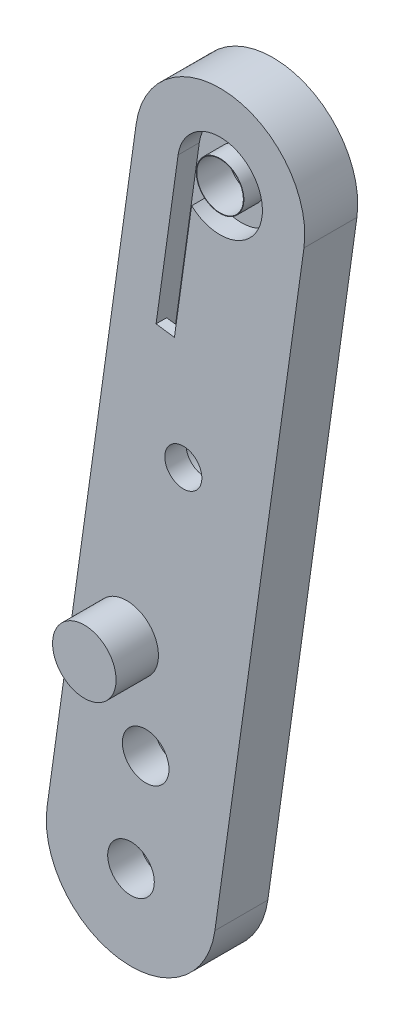
ISO-10303-21;
HEADER;
FILE_DESCRIPTION(('STEP AP214'),'2;1');
FILE_NAME('part.step','',(''),(''),'','','');
FILE_SCHEMA(('AUTOMOTIVE_DESIGN { 1 0 10303 214 1 1 1 1 }'));
ENDSEC;
DATA;
#1=APPLICATION_CONTEXT('core data for automotive mechanical design processes');
#2=APPLICATION_PROTOCOL_DEFINITION('international standard','automotive_design',2000,#1);
#3=PRODUCT_CONTEXT('',#1,'mechanical');
#4=PRODUCT('Part','Part','',(#3));
#5=PRODUCT_RELATED_PRODUCT_CATEGORY('part','',(#4));
#6=PRODUCT_DEFINITION_FORMATION('','',#4);
#7=PRODUCT_DEFINITION_CONTEXT('part definition',#1,'design');
#8=PRODUCT_DEFINITION('design','',#6,#7);
#9=PRODUCT_DEFINITION_SHAPE('','',#8);
#10=(LENGTH_UNIT() NAMED_UNIT(*) SI_UNIT(.MILLI.,.METRE.));
#11=(NAMED_UNIT(*) PLANE_ANGLE_UNIT() SI_UNIT($,.RADIAN.));
#12=(NAMED_UNIT(*) SI_UNIT($,.STERADIAN.) SOLID_ANGLE_UNIT());
#13=UNCERTAINTY_MEASURE_WITH_UNIT(LENGTH_MEASURE(1.E-05),#10,'distance_accuracy_value','');
#14=(GEOMETRIC_REPRESENTATION_CONTEXT(3) GLOBAL_UNCERTAINTY_ASSIGNED_CONTEXT((#13)) GLOBAL_UNIT_ASSIGNED_CONTEXT((#10,
#11,#12)) REPRESENTATION_CONTEXT('',''));
#15=CARTESIAN_POINT('',(0.,0.,0.));
#16=DIRECTION('',(0.,0.,1.));
#17=DIRECTION('',(1.,0.,0.));
#18=AXIS2_PLACEMENT_3D('',#15,#16,#17);
#19=CARTESIAN_POINT('',(4.12057593436907,29.2917175333188,-3.));
#20=DIRECTION('',(0.,0.,1.));
#21=DIRECTION('',(1.,0.,0.));
#22=AXIS2_PLACEMENT_3D('',#19,#20,#21);
#23=CYLINDRICAL_SURFACE('',#22,2.2);
#24=CARTESIAN_POINT('',(4.12057593436907,29.2917175333188,0.));
#25=DIRECTION('',(0.,0.,1.));
#26=DIRECTION('',(1.,0.,0.));
#27=AXIS2_PLACEMENT_3D('',#24,#25,#26);
#28=CIRCLE('',#27,2.2);
#29=CARTESIAN_POINT('',(6.32057593436907,29.2917175333188,0.));
#30=VERTEX_POINT('',#29);
#31=EDGE_CURVE('E19',#30,#30,#28,.T.);
#32=ORIENTED_EDGE('',*,*,#31,.T.);
#33=EDGE_LOOP('',(#32));
#34=FACE_BOUND('',#33,.T.);
#35=CARTESIAN_POINT('',(4.12057593436907,29.2917175333188,-3.));
#36=DIRECTION('',(0.,0.,1.));
#37=DIRECTION('',(1.,0.,0.));
#38=AXIS2_PLACEMENT_3D('',#35,#36,#37);
#39=CIRCLE('',#38,2.2);
#40=CARTESIAN_POINT('',(6.32057593436907,29.2917175333188,-3.));
#41=VERTEX_POINT('',#40);
#42=EDGE_CURVE('E166',#41,#41,#39,.T.);
#43=ORIENTED_EDGE('',*,*,#42,.F.);
#44=EDGE_LOOP('',(#43));
#45=FACE_BOUND('',#44,.T.);
#46=ADVANCED_FACE('F16',(#34,#45),#23,.F.);
#47=CARTESIAN_POINT('',(0.,0.,0.));
#48=DIRECTION('',(0.,0.,-1.));
#49=DIRECTION('',(-1.,0.,0.));
#50=AXIS2_PLACEMENT_3D('',#47,#48,#49);
#51=PLANE('',#50);
#52=CARTESIAN_POINT('',(4.12057593436907,29.2917175333188,0.));
#53=DIRECTION('',(0.,0.,1.));
#54=DIRECTION('',(1.,0.,0.));
#55=AXIS2_PLACEMENT_3D('',#52,#53,#54);
#56=CIRCLE('',#55,2.25);
#57=CARTESIAN_POINT('',(6.37057593436907,29.2917175333188,0.));
#58=VERTEX_POINT('',#57);
#59=EDGE_CURVE('E171',#58,#58,#56,.F.);
#60=ORIENTED_EDGE('',*,*,#59,.F.);
#61=EDGE_LOOP('',(#60));
#62=FACE_BOUND('',#61,.T.);
#63=ORIENTED_EDGE('',*,*,#31,.F.);
#64=EDGE_LOOP('',(#63));
#65=FACE_BOUND('',#64,.T.);
#66=ADVANCED_FACE('F242',(#62,#65),#51,.F.);
#67=CARTESIAN_POINT('',(0.,0.,-3.));
#68=DIRECTION('',(0.,0.,-1.));
#69=DIRECTION('',(-1.,0.,0.));
#70=AXIS2_PLACEMENT_3D('',#67,#68,#69);
#71=PLANE('',#70);
#72=ORIENTED_EDGE('',*,*,#42,.T.);
#73=EDGE_LOOP('',(#72));
#74=FACE_BOUND('',#73,.T.);
#75=CARTESIAN_POINT('',(4.12057593436907,29.2917175333188,-3.));
#76=DIRECTION('',(0.,0.,1.));
#77=DIRECTION('',(1.,0.,0.));
#78=AXIS2_PLACEMENT_3D('',#75,#76,#77);
#79=CIRCLE('',#78,4.5);
#80=CARTESIAN_POINT('',(8.62057593436907,29.2917175333188,-3.));
#81=VERTEX_POINT('',#80);
#82=EDGE_CURVE('E176',#81,#81,#79,.F.);
#83=ORIENTED_EDGE('',*,*,#82,.T.);
#84=EDGE_LOOP('',(#83));
#85=FACE_BOUND('',#84,.T.);
#86=ADVANCED_FACE('F244',(#74,#85),#71,.T.);
#87=CARTESIAN_POINT('',(1.32896460320901,9.48749557258048,-2.));
#88=DIRECTION('',(-0.138721066002156,-0.990331492908928,0.));
#89=DIRECTION('',(0.990331492908928,-0.138721066002156,0.));
#90=AXIS2_PLACEMENT_3D('',#87,#88,#89);
#91=PLANE('',#90);
#92=DIRECTION('',(0.990331492908928,-0.138721066002157,0.));
#93=VECTOR('',#92,1.);
#94=CARTESIAN_POINT('',(-2.6151713573098,10.0399719391489,-2.));
#95=LINE('',#94,#93);
#96=CARTESIAN_POINT('',(-2.6151713573098,10.0399719391489,-2.));
#97=VERTEX_POINT('',#96);
#98=CARTESIAN_POINT('',(-0.882091244719177,9.79721007364514,-2.));
#99=VERTEX_POINT('',#98);
#100=EDGE_CURVE('E139',#97,#99,#95,.T.);
#101=ORIENTED_EDGE('',*,*,#100,.F.);
#102=DIRECTION('',(0.,0.,1.));
#103=VECTOR('',#102,1.);
#104=CARTESIAN_POINT('',(-2.6151713573098,10.0399719391489,-2.));
#105=LINE('',#104,#103);
#106=CARTESIAN_POINT('',(-2.6151713573098,10.0399719391489,-1.));
#107=VERTEX_POINT('',#106);
#108=EDGE_CURVE('E162',#107,#97,#105,.F.);
#109=ORIENTED_EDGE('',*,*,#108,.F.);
#110=DIRECTION('',(-0.990331492908928,0.138721066002157,0.));
#111=VECTOR('',#110,1.);
#112=CARTESIAN_POINT('',(-0.882091244719177,9.79721007364514,-1.));
#113=LINE('',#112,#111);
#114=CARTESIAN_POINT('',(-0.882091244719177,9.79721007364514,-0.999999999999999));
#115=VERTEX_POINT('',#114);
#116=EDGE_CURVE('E143',#115,#107,#113,.T.);
#117=ORIENTED_EDGE('',*,*,#116,.F.);
#118=DIRECTION('',(0.,0.,1.));
#119=VECTOR('',#118,1.);
#120=CARTESIAN_POINT('',(-0.882091244719177,9.79721007364514,-2.));
#121=LINE('',#120,#119);
#122=EDGE_CURVE('E165',#99,#115,#121,.T.);
#123=ORIENTED_EDGE('',*,*,#122,.F.);
#124=EDGE_LOOP('',(#101,#109,#117,#123));
#125=FACE_BOUND('',#124,.T.);
#126=ADVANCED_FACE('F251',(#125),#91,.F.);
#127=CARTESIAN_POINT('',(4.12057593436907,29.2917175333188,-2.));
#128=DIRECTION('',(0.,0.,1.));
#129=DIRECTION('',(1.,0.,0.));
#130=AXIS2_PLACEMENT_3D('',#127,#128,#129);
#131=CYLINDRICAL_SURFACE('',#130,2.25);
#132=ORIENTED_EDGE('',*,*,#59,.T.);
#133=EDGE_LOOP('',(#132));
#134=FACE_BOUND('',#133,.T.);
#135=CARTESIAN_POINT('',(4.12057593436907,29.2917175333188,-2.));
#136=DIRECTION('',(0.,0.,1.));
#137=DIRECTION('',(1.,0.,0.));
#138=AXIS2_PLACEMENT_3D('',#135,#136,#137);
#139=CIRCLE('',#138,2.25);
#140=CARTESIAN_POINT('',(6.37057593436907,29.2917175333188,-2.));
#141=VERTEX_POINT('',#140);
#142=EDGE_CURVE('E142',#141,#141,#139,.F.);
#143=ORIENTED_EDGE('',*,*,#142,.F.);
#144=EDGE_LOOP('',(#143));
#145=FACE_BOUND('',#144,.T.);
#146=ADVANCED_FACE('F348',(#134,#145),#131,.T.);
#147=CARTESIAN_POINT('',(0.652549284314609,4.53343021059572,-2.));
#148=DIRECTION('',(0.,0.,-1.));
#149=DIRECTION('',(-1.,0.,0.));
#150=AXIS2_PLACEMENT_3D('',#147,#148,#149);
#151=CYLINDRICAL_SURFACE('',#150,3.);
#152=CARTESIAN_POINT('',(0.652549284314609,4.53343021059572,-2.));
#153=DIRECTION('',(0.,0.,-1.));
#154=DIRECTION('',(-1.,0.,0.));
#155=AXIS2_PLACEMENT_3D('',#152,#153,#154);
#156=CIRCLE('',#155,3.);
#157=CARTESIAN_POINT('',(-2.34745071568539,4.53343021059572,-2.));
#158=VERTEX_POINT('',#157);
#159=EDGE_CURVE('E226',#158,#158,#156,.T.);
#160=ORIENTED_EDGE('',*,*,#159,.F.);
#161=EDGE_LOOP('',(#160));
#162=FACE_BOUND('',#161,.T.);
#163=CARTESIAN_POINT('',(0.652549284314609,4.53343021059572,-5.));
#164=DIRECTION('',(0.,0.,-1.));
#165=DIRECTION('',(-1.,0.,0.));
#166=AXIS2_PLACEMENT_3D('',#163,#164,#165);
#167=CIRCLE('',#166,3.);
#168=CARTESIAN_POINT('',(-2.34745071568539,4.53343021059572,-5.));
#169=VERTEX_POINT('',#168);
#170=EDGE_CURVE('E223',#169,#169,#167,.F.);
#171=ORIENTED_EDGE('',*,*,#170,.F.);
#172=EDGE_LOOP('',(#171));
#173=FACE_BOUND('',#172,.T.);
#174=ADVANCED_FACE('F344',(#162,#173),#151,.F.);
#175=CARTESIAN_POINT('',(4.12057593436907,29.2917175333188,-5.));
#176=DIRECTION('',(0.,0.,1.));
#177=DIRECTION('',(1.,0.,0.));
#178=AXIS2_PLACEMENT_3D('',#175,#176,#177);
#179=CYLINDRICAL_SURFACE('',#178,4.5);
#180=ORIENTED_EDGE('',*,*,#82,.F.);
#181=EDGE_LOOP('',(#180));
#182=FACE_BOUND('',#181,.T.);
#183=CARTESIAN_POINT('',(4.12057593436907,29.2917175333188,-5.));
#184=DIRECTION('',(0.,0.,1.));
#185=DIRECTION('',(1.,0.,0.));
#186=AXIS2_PLACEMENT_3D('',#183,#184,#185);
#187=CIRCLE('',#186,4.5);
#188=CARTESIAN_POINT('',(8.62057593436907,29.2917175333188,-5.));
#189=VERTEX_POINT('',#188);
#190=EDGE_CURVE('E214',#189,#189,#187,.T.);
#191=ORIENTED_EDGE('',*,*,#190,.F.);
#192=EDGE_LOOP('',(#191));
#193=FACE_BOUND('',#192,.T.);
#194=ADVANCED_FACE('F340',(#182,#193),#179,.F.);
#195=CARTESIAN_POINT('',(-4.28894176048136,-30.743938574281,-5.));
#196=DIRECTION('',(0.,0.,1.));
#197=DIRECTION('',(1.,0.,0.));
#198=AXIS2_PLACEMENT_3D('',#195,#196,#197);
#199=CYLINDRICAL_SURFACE('',#198,4.5);
#200=CARTESIAN_POINT('',(-4.28894176048136,-30.743938574281,-3.));
#201=DIRECTION('',(0.,0.,1.));
#202=DIRECTION('',(1.,0.,0.));
#203=AXIS2_PLACEMENT_3D('',#200,#201,#202);
#204=CIRCLE('',#203,4.5);
#205=CARTESIAN_POINT('',(0.211058239518639,-30.743938574281,-3.));
#206=VERTEX_POINT('',#205);
#207=EDGE_CURVE('E211',#206,#206,#204,.F.);
#208=ORIENTED_EDGE('',*,*,#207,.F.);
#209=EDGE_LOOP('',(#208));
#210=FACE_BOUND('',#209,.T.);
#211=CARTESIAN_POINT('',(-4.28894176048136,-30.743938574281,-5.));
#212=DIRECTION('',(0.,0.,1.));
#213=DIRECTION('',(1.,0.,0.));
#214=AXIS2_PLACEMENT_3D('',#211,#212,#213);
#215=CIRCLE('',#214,4.5);
#216=CARTESIAN_POINT('',(0.211058239518639,-30.743938574281,-5.));
#217=VERTEX_POINT('',#216);
#218=EDGE_CURVE('E217',#217,#217,#215,.T.);
#219=ORIENTED_EDGE('',*,*,#218,.F.);
#220=EDGE_LOOP('',(#219));
#221=FACE_BOUND('',#220,.T.);
#222=ADVANCED_FACE('F336',(#210,#221),#199,.F.);
#223=CARTESIAN_POINT('',(-2.90173110045983,-20.8406236451918,-5.));
#224=DIRECTION('',(0.,0.,1.));
#225=DIRECTION('',(1.,0.,0.));
#226=AXIS2_PLACEMENT_3D('',#223,#224,#225);
#227=CYLINDRICAL_SURFACE('',#226,4.5);
#228=CARTESIAN_POINT('',(-2.90173110045983,-20.8406236451918,-3.));
#229=DIRECTION('',(0.,0.,1.));
#230=DIRECTION('',(1.,0.,0.));
#231=AXIS2_PLACEMENT_3D('',#228,#229,#230);
#232=CIRCLE('',#231,4.5);
#233=CARTESIAN_POINT('',(1.59826889954017,-20.8406236451918,-3.));
#234=VERTEX_POINT('',#233);
#235=EDGE_CURVE('E208',#234,#234,#232,.F.);
#236=ORIENTED_EDGE('',*,*,#235,.F.);
#237=EDGE_LOOP('',(#236));
#238=FACE_BOUND('',#237,.T.);
#239=CARTESIAN_POINT('',(-2.90173110045983,-20.8406236451918,-5.));
#240=DIRECTION('',(0.,0.,1.));
#241=DIRECTION('',(1.,0.,0.));
#242=AXIS2_PLACEMENT_3D('',#239,#240,#241);
#243=CIRCLE('',#242,4.5);
#244=CARTESIAN_POINT('',(1.59826889954017,-20.8406236451918,-5.));
#245=VERTEX_POINT('',#244);
#246=EDGE_CURVE('E220',#245,#245,#243,.T.);
#247=ORIENTED_EDGE('',*,*,#246,.F.);
#248=EDGE_LOOP('',(#247));
#249=FACE_BOUND('',#248,.T.);
#250=ADVANCED_FACE('F332',(#238,#249),#227,.F.);
#251=CARTESIAN_POINT('',(0.,0.,4.));
#252=DIRECTION('',(0.,0.,1.));
#253=DIRECTION('',(1.,0.,0.));
#254=AXIS2_PLACEMENT_3D('',#251,#252,#253);
#255=PLANE('',#254);
#256=CARTESIAN_POINT('',(-4.69563830162392,-12.0212190760833,4.));
#257=DIRECTION('',(0.,0.,-1.));
#258=DIRECTION('',(-1.,0.,0.));
#259=AXIS2_PLACEMENT_3D('',#256,#257,#258);
#260=CIRCLE('',#259,3.00000000000001);
#261=CARTESIAN_POINT('',(-7.69563830162393,-12.0212190760833,4.));
#262=VERTEX_POINT('',#261);
#263=EDGE_CURVE('E148',#262,#262,#260,.T.);
#264=ORIENTED_EDGE('',*,*,#263,.F.);
#265=EDGE_LOOP('',(#264));
#266=FACE_BOUND('',#265,.T.);
#267=ADVANCED_FACE('F328',(#266),#255,.T.);
#268=CARTESIAN_POINT('',(0.,0.,-1.));
#269=DIRECTION('',(0.,0.,-1.));
#270=DIRECTION('',(-1.,0.,0.));
#271=AXIS2_PLACEMENT_3D('',#268,#269,#270);
#272=PLANE('',#271);
#273=DIRECTION('',(0.138721066002158,0.990331492908928,0.));
#274=VECTOR('',#273,1.);
#275=CARTESIAN_POINT('',(-3.94413596051883,0.552476366568434,-1.));
#276=LINE('',#275,#274);
#277=CARTESIAN_POINT('',(-1.92156602729901,14.9916294036936,-1.));
#278=VERTEX_POINT('',#277);
#279=EDGE_CURVE('E112',#278,#107,#276,.F.);
#280=ORIENTED_EDGE('',*,*,#279,.F.);
#281=DIRECTION('',(-0.990331492908927,0.138721066002158,0.));
#282=VECTOR('',#281,1.);
#283=CARTESIAN_POINT('',(-0.188485914708387,14.7488675381898,-1.));
#284=LINE('',#283,#282);
#285=CARTESIAN_POINT('',(-0.188485914708386,14.7488675381898,-1.));
#286=VERTEX_POINT('',#285);
#287=EDGE_CURVE('E131',#286,#278,#284,.T.);
#288=ORIENTED_EDGE('',*,*,#287,.F.);
#289=DIRECTION('',(0.138721066002158,0.990331492908928,0.));
#290=VECTOR('',#289,1.);
#291=CARTESIAN_POINT('',(-2.21105584792821,0.309714501064658,-1.));
#292=LINE('',#291,#290);
#293=EDGE_CURVE('E130',#286,#115,#292,.F.);
#294=ORIENTED_EDGE('',*,*,#293,.T.);
#295=ORIENTED_EDGE('',*,*,#116,.T.);
#296=EDGE_LOOP('',(#280,#288,#294,#295));
#297=FACE_BOUND('',#296,.T.);
#298=ADVANCED_FACE('F324',(#297),#272,.T.);
#299=CARTESIAN_POINT('',(0.,0.,-2.));
#300=DIRECTION('',(0.,0.,1.));
#301=DIRECTION('',(1.,0.,0.));
#302=AXIS2_PLACEMENT_3D('',#299,#300,#301);
#303=PLANE('',#302);
#304=ORIENTED_EDGE('',*,*,#142,.T.);
#305=EDGE_LOOP('',(#304));
#306=FACE_BOUND('',#305,.T.);
#307=ORIENTED_EDGE('',*,*,#100,.T.);
#308=DIRECTION('',(0.138721066002158,0.990331492908928,0.));
#309=VECTOR('',#308,1.);
#310=CARTESIAN_POINT('',(-2.21105584792821,0.309714501064658,-2.));
#311=LINE('',#310,#309);
#312=CARTESIAN_POINT('',(1.43355327251462,26.3286263746332,-2.));
#313=VERTEX_POINT('',#312);
#314=EDGE_CURVE('E126',#99,#313,#311,.T.);
#315=ORIENTED_EDGE('',*,*,#314,.T.);
#316=CARTESIAN_POINT('',(4.12057593436907,29.2917175333188,-2.));
#317=DIRECTION('',(0.,0.,1.));
#318=DIRECTION('',(1.,0.,0.));
#319=AXIS2_PLACEMENT_3D('',#316,#317,#318);
#320=CIRCLE('',#319,4.);
#321=CARTESIAN_POINT('',(0.159249962733359,29.8466017973275,-2.));
#322=VERTEX_POINT('',#321);
#323=EDGE_CURVE('E113',#313,#322,#320,.T.);
#324=ORIENTED_EDGE('',*,*,#323,.T.);
#325=DIRECTION('',(0.138721066002158,0.990331492908928,0.));
#326=VECTOR('',#325,1.);
#327=CARTESIAN_POINT('',(-3.94413596051883,0.552476366568434,-2.));
#328=LINE('',#327,#326);
#329=EDGE_CURVE('E108',#97,#322,#328,.T.);
#330=ORIENTED_EDGE('',*,*,#329,.F.);
#331=EDGE_LOOP('',(#307,#315,#324,#330));
#332=FACE_BOUND('',#331,.T.);
#333=ADVANCED_FACE('F320',(#306,#332),#303,.T.);
#334=CARTESIAN_POINT('',(0.652549284314609,4.53343021059572,-2.));
#335=DIRECTION('',(0.,0.,-1.));
#336=DIRECTION('',(-1.,0.,0.));
#337=AXIS2_PLACEMENT_3D('',#334,#335,#336);
#338=PLANE('',#337);
#339=ORIENTED_EDGE('',*,*,#159,.T.);
#340=EDGE_LOOP('',(#339));
#341=FACE_BOUND('',#340,.T.);
#342=CARTESIAN_POINT('',(0.652549284314609,4.53343021059572,-2.));
#343=DIRECTION('',(0.,0.,-1.));
#344=DIRECTION('',(-1.,0.,0.));
#345=AXIS2_PLACEMENT_3D('',#342,#343,#344);
#346=CIRCLE('',#345,1.75);
#347=CARTESIAN_POINT('',(-1.09745071568539,4.53343021059572,-2.));
#348=VERTEX_POINT('',#347);
#349=EDGE_CURVE('E107',#348,#348,#346,.F.);
#350=ORIENTED_EDGE('',*,*,#349,.T.);
#351=EDGE_LOOP('',(#350));
#352=FACE_BOUND('',#351,.T.);
#353=ADVANCED_FACE('F317',(#341,#352),#338,.T.);
#354=CARTESIAN_POINT('',(0.,0.,-5.));
#355=DIRECTION('',(0.,0.,-1.));
#356=DIRECTION('',(-1.,0.,0.));
#357=AXIS2_PLACEMENT_3D('',#354,#355,#356);
#358=PLANE('',#357);
#359=CARTESIAN_POINT('',(-4.28894176048139,-30.743938574281,-5.));
#360=DIRECTION('',(0.,0.,1.));
#361=DIRECTION('',(1.,0.,0.));
#362=AXIS2_PLACEMENT_3D('',#359,#360,#361);
#363=CIRCLE('',#362,8.);
#364=CARTESIAN_POINT('',(-12.2115937037528,-29.6341700462638,-5.));
#365=VERTEX_POINT('',#364);
#366=CARTESIAN_POINT('',(3.63371018279002,-31.8537071022983,-5.));
#367=VERTEX_POINT('',#366);
#368=EDGE_CURVE('E77',#365,#367,#363,.T.);
#369=ORIENTED_EDGE('',*,*,#368,.F.);
#370=DIRECTION('',(0.138721066002159,0.990331492908927,0.));
#371=VECTOR('',#370,1.);
#372=CARTESIAN_POINT('',(-7.90546193215457,1.10736063057708,-5.));
#373=LINE('',#372,#371);
#374=CARTESIAN_POINT('',(-3.80207600890234,30.4014860613361,-5.));
#375=VERTEX_POINT('',#374);
#376=EDGE_CURVE('E82',#365,#375,#373,.T.);
#377=ORIENTED_EDGE('',*,*,#376,.T.);
#378=CARTESIAN_POINT('',(4.12057593436907,29.2917175333188,-5.));
#379=DIRECTION('',(0.,0.,1.));
#380=DIRECTION('',(1.,0.,0.));
#381=AXIS2_PLACEMENT_3D('',#378,#379,#380);
#382=CIRCLE('',#381,8.);
#383=CARTESIAN_POINT('',(12.0432278776405,28.1819490053016,-5.));
#384=VERTEX_POINT('',#383);
#385=EDGE_CURVE('E135',#384,#375,#382,.T.);
#386=ORIENTED_EDGE('',*,*,#385,.F.);
#387=DIRECTION('',(0.138721066002159,0.990331492908927,0.));
#388=VECTOR('',#387,1.);
#389=CARTESIAN_POINT('',(7.93984195438826,-1.11217642545747,-5.));
#390=LINE('',#389,#388);
#391=EDGE_CURVE('E83',#367,#384,#390,.T.);
#392=ORIENTED_EDGE('',*,*,#391,.F.);
#393=EDGE_LOOP('',(#369,#377,#386,#392));
#394=FACE_BOUND('',#393,.T.);
#395=ORIENTED_EDGE('',*,*,#190,.T.);
#396=EDGE_LOOP('',(#395));
#397=FACE_BOUND('',#396,.T.);
#398=ORIENTED_EDGE('',*,*,#218,.T.);
#399=EDGE_LOOP('',(#398));
#400=FACE_BOUND('',#399,.T.);
#401=ORIENTED_EDGE('',*,*,#246,.T.);
#402=EDGE_LOOP('',(#401));
#403=FACE_BOUND('',#402,.T.);
#404=ORIENTED_EDGE('',*,*,#170,.T.);
#405=EDGE_LOOP('',(#404));
#406=FACE_BOUND('',#405,.T.);
#407=ADVANCED_FACE('F79',(#394,#397,#400,#403,#406),#358,.T.);
#408=CARTESIAN_POINT('',(0.,0.,-3.));
#409=DIRECTION('',(0.,0.,-1.));
#410=DIRECTION('',(-1.,0.,0.));
#411=AXIS2_PLACEMENT_3D('',#408,#409,#410);
#412=PLANE('',#411);
#413=ORIENTED_EDGE('',*,*,#207,.T.);
#414=EDGE_LOOP('',(#413));
#415=FACE_BOUND('',#414,.T.);
#416=CARTESIAN_POINT('',(-4.28894176048136,-30.743938574281,-3.));
#417=DIRECTION('',(0.,0.,1.));
#418=DIRECTION('',(1.,0.,0.));
#419=AXIS2_PLACEMENT_3D('',#416,#417,#418);
#420=CIRCLE('',#419,2.2);
#421=CARTESIAN_POINT('',(-2.08894176048136,-30.743938574281,-3.));
#422=VERTEX_POINT('',#421);
#423=EDGE_CURVE('E102',#422,#422,#420,.T.);
#424=ORIENTED_EDGE('',*,*,#423,.T.);
#425=EDGE_LOOP('',(#424));
#426=FACE_BOUND('',#425,.T.);
#427=ADVANCED_FACE('F310',(#415,#426),#412,.T.);
#428=CARTESIAN_POINT('',(0.,0.,-3.));
#429=DIRECTION('',(0.,0.,-1.));
#430=DIRECTION('',(-1.,0.,0.));
#431=AXIS2_PLACEMENT_3D('',#428,#429,#430);
#432=PLANE('',#431);
#433=ORIENTED_EDGE('',*,*,#235,.T.);
#434=EDGE_LOOP('',(#433));
#435=FACE_BOUND('',#434,.T.);
#436=CARTESIAN_POINT('',(-2.90173110045983,-20.8406236451918,-3.));
#437=DIRECTION('',(0.,0.,1.));
#438=DIRECTION('',(1.,0.,0.));
#439=AXIS2_PLACEMENT_3D('',#436,#437,#438);
#440=CIRCLE('',#439,2.2);
#441=CARTESIAN_POINT('',(-0.701731100459825,-20.8406236451918,-3.));
#442=VERTEX_POINT('',#441);
#443=EDGE_CURVE('E196',#442,#442,#440,.T.);
#444=ORIENTED_EDGE('',*,*,#443,.T.);
#445=EDGE_LOOP('',(#444));
#446=FACE_BOUND('',#445,.T.);
#447=ADVANCED_FACE('F306',(#435,#446),#432,.T.);
#448=CARTESIAN_POINT('',(-4.69563830162392,-12.0212190760833,4.));
#449=DIRECTION('',(0.,0.,-1.));
#450=DIRECTION('',(-1.,0.,0.));
#451=AXIS2_PLACEMENT_3D('',#448,#449,#450);
#452=CYLINDRICAL_SURFACE('',#451,3.00000000000001);
#453=CARTESIAN_POINT('',(-4.69563830162392,-12.0212190760833,0.));
#454=DIRECTION('',(0.,0.,-1.));
#455=DIRECTION('',(-1.,0.,0.));
#456=AXIS2_PLACEMENT_3D('',#453,#454,#455);
#457=CIRCLE('',#456,3.00000000000001);
#458=CARTESIAN_POINT('',(-7.69563830162393,-12.0212190760833,0.));
#459=VERTEX_POINT('',#458);
#460=EDGE_CURVE('E120',#459,#459,#457,.F.);
#461=ORIENTED_EDGE('',*,*,#460,.T.);
#462=EDGE_LOOP('',(#461));
#463=FACE_BOUND('',#462,.T.);
#464=ORIENTED_EDGE('',*,*,#263,.T.);
#465=EDGE_LOOP('',(#464));
#466=FACE_BOUND('',#465,.T.);
#467=ADVANCED_FACE('F302',(#463,#466),#452,.T.);
#468=CARTESIAN_POINT('',(-0.188485914708387,14.7488675381898,-1.));
#469=DIRECTION('',(0.138721066002158,0.990331492908927,0.));
#470=DIRECTION('',(-0.990331492908927,0.138721066002158,0.));
#471=AXIS2_PLACEMENT_3D('',#468,#469,#470);
#472=PLANE('',#471);
#473=ORIENTED_EDGE('',*,*,#287,.T.);
#474=DIRECTION('',(0.,0.,1.));
#475=VECTOR('',#474,1.);
#476=CARTESIAN_POINT('',(-1.92156602729901,14.9916294036936,-2.));
#477=LINE('',#476,#475);
#478=CARTESIAN_POINT('',(-1.92156602729901,14.9916294036936,0.));
#479=VERTEX_POINT('',#478);
#480=EDGE_CURVE('E109',#479,#278,#477,.F.);
#481=ORIENTED_EDGE('',*,*,#480,.F.);
#482=DIRECTION('',(0.990331492908928,-0.138721066002156,0.));
#483=VECTOR('',#482,1.);
#484=CARTESIAN_POINT('',(-1.92156602729901,14.9916294036935,0.));
#485=LINE('',#484,#483);
#486=CARTESIAN_POINT('',(-0.188485914708386,14.7488675381898,0.));
#487=VERTEX_POINT('',#486);
#488=EDGE_CURVE('E116',#479,#487,#485,.T.);
#489=ORIENTED_EDGE('',*,*,#488,.T.);
#490=DIRECTION('',(0.,0.,1.));
#491=VECTOR('',#490,1.);
#492=CARTESIAN_POINT('',(-0.188485914708385,14.7488675381898,-2.));
#493=LINE('',#492,#491);
#494=EDGE_CURVE('E127',#487,#286,#493,.F.);
#495=ORIENTED_EDGE('',*,*,#494,.T.);
#496=EDGE_LOOP('',(#473,#481,#489,#495));
#497=FACE_BOUND('',#496,.T.);
#498=ADVANCED_FACE('F298',(#497),#472,.T.);
#499=CARTESIAN_POINT('',(-2.21105584792821,0.309714501064658,-2.));
#500=DIRECTION('',(0.990331492908928,-0.138721066002158,0.));
#501=DIRECTION('',(0.138721066002158,0.990331492908928,0.));
#502=AXIS2_PLACEMENT_3D('',#499,#500,#501);
#503=PLANE('',#502);
#504=DIRECTION('',(0.,0.,1.));
#505=VECTOR('',#504,1.);
#506=CARTESIAN_POINT('',(1.43355327251462,26.3286263746332,-2.));
#507=LINE('',#506,#505);
#508=CARTESIAN_POINT('',(1.43355327251462,26.3286263746332,0.));
#509=VERTEX_POINT('',#508);
#510=EDGE_CURVE('E123',#509,#313,#507,.F.);
#511=ORIENTED_EDGE('',*,*,#510,.T.);
#512=ORIENTED_EDGE('',*,*,#314,.F.);
#513=ORIENTED_EDGE('',*,*,#122,.T.);
#514=ORIENTED_EDGE('',*,*,#293,.F.);
#515=ORIENTED_EDGE('',*,*,#494,.F.);
#516=DIRECTION('',(0.138721066002158,0.990331492908927,0.));
#517=VECTOR('',#516,1.);
#518=CARTESIAN_POINT('',(-0.188485914708386,14.7488675381898,0.));
#519=LINE('',#518,#517);
#520=EDGE_CURVE('E119',#487,#509,#519,.T.);
#521=ORIENTED_EDGE('',*,*,#520,.T.);
#522=EDGE_LOOP('',(#511,#512,#513,#514,#515,#521));
#523=FACE_BOUND('',#522,.T.);
#524=ADVANCED_FACE('F294',(#523),#503,.F.);
#525=CARTESIAN_POINT('',(4.12057593436907,29.2917175333188,-2.));
#526=DIRECTION('',(0.,0.,1.));
#527=DIRECTION('',(1.,0.,0.));
#528=AXIS2_PLACEMENT_3D('',#525,#526,#527);
#529=CYLINDRICAL_SURFACE('',#528,4.);
#530=DIRECTION('',(0.,0.,1.));
#531=VECTOR('',#530,1.);
#532=CARTESIAN_POINT('',(0.159249962733361,29.8466017973275,-2.));
#533=LINE('',#532,#531);
#534=CARTESIAN_POINT('',(0.15924996273336,29.8466017973275,0.));
#535=VERTEX_POINT('',#534);
#536=EDGE_CURVE('E105',#322,#535,#533,.T.);
#537=ORIENTED_EDGE('',*,*,#536,.F.);
#538=ORIENTED_EDGE('',*,*,#323,.F.);
#539=ORIENTED_EDGE('',*,*,#510,.F.);
#540=CARTESIAN_POINT('',(4.12057593436907,29.2917175333188,0.));
#541=DIRECTION('',(0.,0.,1.));
#542=DIRECTION('',(1.,0.,0.));
#543=AXIS2_PLACEMENT_3D('',#540,#541,#542);
#544=CIRCLE('',#543,4.);
#545=EDGE_CURVE('E191',#509,#535,#544,.T.);
#546=ORIENTED_EDGE('',*,*,#545,.T.);
#547=EDGE_LOOP('',(#537,#538,#539,#546));
#548=FACE_BOUND('',#547,.T.);
#549=ADVANCED_FACE('F290',(#548),#529,.F.);
#550=CARTESIAN_POINT('',(-3.94413596051883,0.552476366568434,-2.));
#551=DIRECTION('',(0.990331492908928,-0.138721066002158,0.));
#552=DIRECTION('',(0.138721066002158,0.990331492908928,0.));
#553=AXIS2_PLACEMENT_3D('',#550,#551,#552);
#554=PLANE('',#553);
#555=ORIENTED_EDGE('',*,*,#536,.T.);
#556=DIRECTION('',(-0.138721066002158,-0.990331492908928,0.));
#557=VECTOR('',#556,1.);
#558=CARTESIAN_POINT('',(0.15924996273336,29.8466017973275,0.));
#559=LINE('',#558,#557);
#560=EDGE_CURVE('E190',#535,#479,#559,.T.);
#561=ORIENTED_EDGE('',*,*,#560,.T.);
#562=ORIENTED_EDGE('',*,*,#480,.T.);
#563=ORIENTED_EDGE('',*,*,#279,.T.);
#564=ORIENTED_EDGE('',*,*,#108,.T.);
#565=ORIENTED_EDGE('',*,*,#329,.T.);
#566=EDGE_LOOP('',(#555,#561,#562,#563,#564,#565));
#567=FACE_BOUND('',#566,.T.);
#568=ADVANCED_FACE('F286',(#567),#554,.T.);
#569=CARTESIAN_POINT('',(0.652549284314609,4.53343021059572,5.));
#570=DIRECTION('',(0.,0.,-1.));
#571=DIRECTION('',(-1.,0.,0.));
#572=AXIS2_PLACEMENT_3D('',#569,#570,#571);
#573=CYLINDRICAL_SURFACE('',#572,1.75);
#574=ORIENTED_EDGE('',*,*,#349,.F.);
#575=EDGE_LOOP('',(#574));
#576=FACE_BOUND('',#575,.T.);
#577=CARTESIAN_POINT('',(0.652549284314609,4.53343021059572,0.));
#578=DIRECTION('',(0.,0.,-1.));
#579=DIRECTION('',(-1.,0.,0.));
#580=AXIS2_PLACEMENT_3D('',#577,#578,#579);
#581=CIRCLE('',#580,1.75);
#582=CARTESIAN_POINT('',(-1.09745071568539,4.53343021059572,0.));
#583=VERTEX_POINT('',#582);
#584=EDGE_CURVE('E187',#583,#583,#581,.F.);
#585=ORIENTED_EDGE('',*,*,#584,.T.);
#586=EDGE_LOOP('',(#585));
#587=FACE_BOUND('',#586,.T.);
#588=ADVANCED_FACE('F282',(#576,#587),#573,.F.);
#589=CARTESIAN_POINT('',(4.12057593436907,29.2917175333188,-5.));
#590=DIRECTION('',(0.,0.,1.));
#591=DIRECTION('',(1.,0.,0.));
#592=AXIS2_PLACEMENT_3D('',#589,#590,#591);
#593=CYLINDRICAL_SURFACE('',#592,8.);
#594=ORIENTED_EDGE('',*,*,#385,.T.);
#595=DIRECTION('',(0.,0.,1.));
#596=VECTOR('',#595,1.);
#597=CARTESIAN_POINT('',(-3.80207600890234,30.4014860613361,-5.));
#598=LINE('',#597,#596);
#599=CARTESIAN_POINT('',(-3.80207600890234,30.4014860613361,0.));
#600=VERTEX_POINT('',#599);
#601=EDGE_CURVE('E93',#375,#600,#598,.T.);
#602=ORIENTED_EDGE('',*,*,#601,.T.);
#603=CARTESIAN_POINT('',(4.12057593436907,29.2917175333188,0.));
#604=DIRECTION('',(0.,0.,1.));
#605=DIRECTION('',(1.,0.,0.));
#606=AXIS2_PLACEMENT_3D('',#603,#604,#605);
#607=CIRCLE('',#606,8.);
#608=CARTESIAN_POINT('',(12.0432278776405,28.1819490053016,0.));
#609=VERTEX_POINT('',#608);
#610=EDGE_CURVE('E184',#600,#609,#607,.F.);
#611=ORIENTED_EDGE('',*,*,#610,.T.);
#612=DIRECTION('',(0.,0.,1.));
#613=VECTOR('',#612,1.);
#614=CARTESIAN_POINT('',(12.0432278776405,28.1819490053016,-5.));
#615=LINE('',#614,#613);
#616=EDGE_CURVE('E84',#384,#609,#615,.T.);
#617=ORIENTED_EDGE('',*,*,#616,.F.);
#618=EDGE_LOOP('',(#594,#602,#611,#617));
#619=FACE_BOUND('',#618,.T.);
#620=ADVANCED_FACE('F278',(#619),#593,.T.);
#621=CARTESIAN_POINT('',(7.93984195438826,-1.11217642545747,-5.));
#622=DIRECTION('',(0.990331492908927,-0.138721066002159,0.));
#623=DIRECTION('',(0.138721066002159,0.990331492908927,0.));
#624=AXIS2_PLACEMENT_3D('',#621,#622,#623);
#625=PLANE('',#624);
#626=ORIENTED_EDGE('',*,*,#391,.T.);
#627=ORIENTED_EDGE('',*,*,#616,.T.);
#628=DIRECTION('',(-0.138721066002159,-0.990331492908927,0.));
#629=VECTOR('',#628,1.);
#630=CARTESIAN_POINT('',(12.0432278776405,28.1819490053016,0.));
#631=LINE('',#630,#629);
#632=CARTESIAN_POINT('',(3.63371018279002,-31.8537071022983,0.));
#633=VERTEX_POINT('',#632);
#634=EDGE_CURVE('E183',#609,#633,#631,.T.);
#635=ORIENTED_EDGE('',*,*,#634,.T.);
#636=DIRECTION('',(0.,0.,1.));
#637=VECTOR('',#636,1.);
#638=CARTESIAN_POINT('',(3.63371018279002,-31.8537071022983,-5.));
#639=LINE('',#638,#637);
#640=EDGE_CURVE('E38',#367,#633,#639,.T.);
#641=ORIENTED_EDGE('',*,*,#640,.F.);
#642=EDGE_LOOP('',(#626,#627,#635,#641));
#643=FACE_BOUND('',#642,.T.);
#644=ADVANCED_FACE('F275',(#643),#625,.T.);
#645=CARTESIAN_POINT('',(-4.28894176048139,-30.743938574281,-5.));
#646=DIRECTION('',(0.,0.,1.));
#647=DIRECTION('',(1.,0.,0.));
#648=AXIS2_PLACEMENT_3D('',#645,#646,#647);
#649=CYLINDRICAL_SURFACE('',#648,8.);
#650=ORIENTED_EDGE('',*,*,#640,.T.);
#651=CARTESIAN_POINT('',(-4.28894176048139,-30.743938574281,0.));
#652=DIRECTION('',(0.,0.,1.));
#653=DIRECTION('',(1.,0.,0.));
#654=AXIS2_PLACEMENT_3D('',#651,#652,#653);
#655=CIRCLE('',#654,8.);
#656=CARTESIAN_POINT('',(-12.2115937037528,-29.6341700462638,0.));
#657=VERTEX_POINT('',#656);
#658=EDGE_CURVE('E32',#633,#657,#655,.F.);
#659=ORIENTED_EDGE('',*,*,#658,.T.);
#660=DIRECTION('',(0.,0.,1.));
#661=VECTOR('',#660,1.);
#662=CARTESIAN_POINT('',(-12.2115937037528,-29.6341700462638,-5.));
#663=LINE('',#662,#661);
#664=EDGE_CURVE('E90',#657,#365,#663,.F.);
#665=ORIENTED_EDGE('',*,*,#664,.T.);
#666=ORIENTED_EDGE('',*,*,#368,.T.);
#667=EDGE_LOOP('',(#650,#659,#665,#666));
#668=FACE_BOUND('',#667,.T.);
#669=ADVANCED_FACE('F95',(#668),#649,.T.);
#670=CARTESIAN_POINT('',(-7.90546193215457,1.10736063057708,-5.));
#671=DIRECTION('',(0.990331492908927,-0.138721066002159,0.));
#672=DIRECTION('',(0.138721066002159,0.990331492908927,0.));
#673=AXIS2_PLACEMENT_3D('',#670,#671,#672);
#674=PLANE('',#673);
#675=ORIENTED_EDGE('',*,*,#601,.F.);
#676=ORIENTED_EDGE('',*,*,#376,.F.);
#677=ORIENTED_EDGE('',*,*,#664,.F.);
#678=DIRECTION('',(0.138721066002159,0.990331492908927,0.));
#679=VECTOR('',#678,1.);
#680=CARTESIAN_POINT('',(-12.2115937037528,-29.6341700462638,0.));
#681=LINE('',#680,#679);
#682=EDGE_CURVE('E181',#657,#600,#681,.T.);
#683=ORIENTED_EDGE('',*,*,#682,.T.);
#684=EDGE_LOOP('',(#675,#676,#677,#683));
#685=FACE_BOUND('',#684,.T.);
#686=ADVANCED_FACE('F88',(#685),#674,.F.);
#687=CARTESIAN_POINT('',(-4.28894176048136,-30.743938574281,-3.));
#688=DIRECTION('',(0.,0.,1.));
#689=DIRECTION('',(1.,0.,0.));
#690=AXIS2_PLACEMENT_3D('',#687,#688,#689);
#691=CYLINDRICAL_SURFACE('',#690,2.2);
#692=ORIENTED_EDGE('',*,*,#423,.F.);
#693=EDGE_LOOP('',(#692));
#694=FACE_BOUND('',#693,.T.);
#695=CARTESIAN_POINT('',(-4.28894176048136,-30.743938574281,0.));
#696=DIRECTION('',(0.,0.,1.));
#697=DIRECTION('',(1.,0.,0.));
#698=AXIS2_PLACEMENT_3D('',#695,#696,#697);
#699=CIRCLE('',#698,2.2);
#700=CARTESIAN_POINT('',(-2.08894176048136,-30.743938574281,0.));
#701=VERTEX_POINT('',#700);
#702=EDGE_CURVE('E24',#701,#701,#699,.T.);
#703=ORIENTED_EDGE('',*,*,#702,.T.);
#704=EDGE_LOOP('',(#703));
#705=FACE_BOUND('',#704,.T.);
#706=ADVANCED_FACE('F262',(#694,#705),#691,.F.);
#707=CARTESIAN_POINT('',(-2.90173110045983,-20.8406236451918,-3.));
#708=DIRECTION('',(0.,0.,1.));
#709=DIRECTION('',(1.,0.,0.));
#710=AXIS2_PLACEMENT_3D('',#707,#708,#709);
#711=CYLINDRICAL_SURFACE('',#710,2.2);
#712=ORIENTED_EDGE('',*,*,#443,.F.);
#713=EDGE_LOOP('',(#712));
#714=FACE_BOUND('',#713,.T.);
#715=CARTESIAN_POINT('',(-2.90173110045983,-20.8406236451918,0.));
#716=DIRECTION('',(0.,0.,1.));
#717=DIRECTION('',(1.,0.,0.));
#718=AXIS2_PLACEMENT_3D('',#715,#716,#717);
#719=CIRCLE('',#718,2.2);
#720=CARTESIAN_POINT('',(-0.701731100459825,-20.8406236451918,0.));
#721=VERTEX_POINT('',#720);
#722=EDGE_CURVE('E11',#721,#721,#719,.T.);
#723=ORIENTED_EDGE('',*,*,#722,.T.);
#724=EDGE_LOOP('',(#723));
#725=FACE_BOUND('',#724,.T.);
#726=ADVANCED_FACE('F256',(#714,#725),#711,.F.);
#727=CARTESIAN_POINT('',(0.,0.,0.));
#728=DIRECTION('',(0.,0.,-1.));
#729=DIRECTION('',(-1.,0.,0.));
#730=AXIS2_PLACEMENT_3D('',#727,#728,#729);
#731=PLANE('',#730);
#732=ORIENTED_EDGE('',*,*,#722,.F.);
#733=EDGE_LOOP('',(#732));
#734=FACE_BOUND('',#733,.T.);
#735=ORIENTED_EDGE('',*,*,#702,.F.);
#736=EDGE_LOOP('',(#735));
#737=FACE_BOUND('',#736,.T.);
#738=ORIENTED_EDGE('',*,*,#682,.F.);
#739=ORIENTED_EDGE('',*,*,#658,.F.);
#740=ORIENTED_EDGE('',*,*,#634,.F.);
#741=ORIENTED_EDGE('',*,*,#610,.F.);
#742=EDGE_LOOP('',(#738,#739,#740,#741));
#743=FACE_BOUND('',#742,.T.);
#744=ORIENTED_EDGE('',*,*,#584,.F.);
#745=EDGE_LOOP('',(#744));
#746=FACE_BOUND('',#745,.T.);
#747=ORIENTED_EDGE('',*,*,#545,.F.);
#748=ORIENTED_EDGE('',*,*,#520,.F.);
#749=ORIENTED_EDGE('',*,*,#488,.F.);
#750=ORIENTED_EDGE('',*,*,#560,.F.);
#751=EDGE_LOOP('',(#747,#748,#749,#750));
#752=FACE_BOUND('',#751,.T.);
#753=ORIENTED_EDGE('',*,*,#460,.F.);
#754=EDGE_LOOP('',(#753));
#755=FACE_BOUND('',#754,.T.);
#756=ADVANCED_FACE('F254',(#734,#737,#743,#746,#752,#755),#731,.F.);
#757=CLOSED_SHELL('',(#46,#66,#86,#126,#146,#174,#194,#222,#250,#267,#298,#333,#353,#407,#427,
#447,#467,#498,#524,#549,#568,#588,#620,#644,#669,#686,#706,#726,#756));
#758=MANIFOLD_SOLID_BREP('B1',#757);
#759=ADVANCED_BREP_SHAPE_REPRESENTATION('',(#18,#758),#14);
#760=SHAPE_DEFINITION_REPRESENTATION(#9,#759);
ENDSEC;
END-ISO-10303-21;
